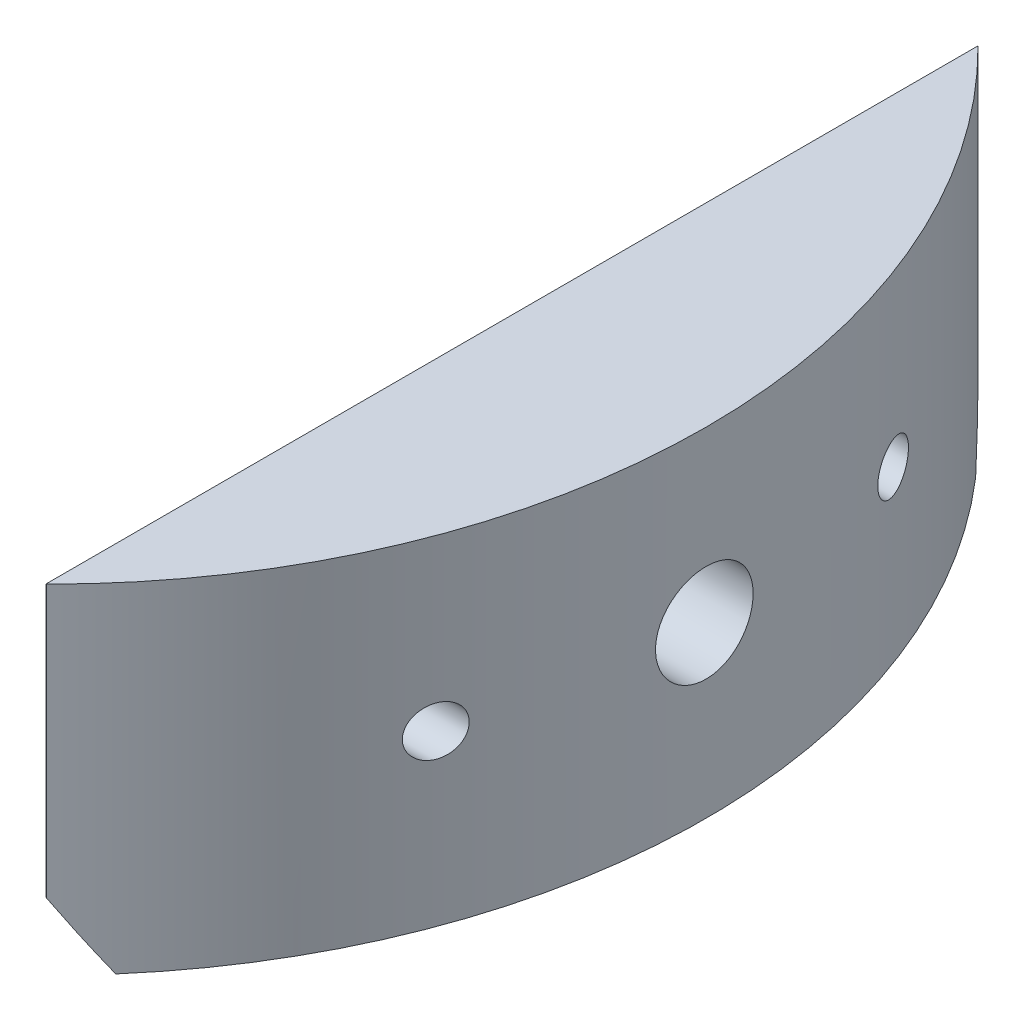
ISO-10303-21;
HEADER;
FILE_DESCRIPTION(('STEP AP214'),'2;1');
FILE_NAME('part.step','',(''),(''),'','','');
FILE_SCHEMA(('AUTOMOTIVE_DESIGN { 1 0 10303 214 1 1 1 1 }'));
ENDSEC;
DATA;
#1=APPLICATION_CONTEXT('core data for automotive mechanical design processes');
#2=APPLICATION_PROTOCOL_DEFINITION('international standard','automotive_design',2000,#1);
#3=PRODUCT_CONTEXT('',#1,'mechanical');
#4=PRODUCT('Part','Part','',(#3));
#5=PRODUCT_RELATED_PRODUCT_CATEGORY('part','',(#4));
#6=PRODUCT_DEFINITION_FORMATION('','',#4);
#7=PRODUCT_DEFINITION_CONTEXT('part definition',#1,'design');
#8=PRODUCT_DEFINITION('design','',#6,#7);
#9=PRODUCT_DEFINITION_SHAPE('','',#8);
#10=(LENGTH_UNIT() NAMED_UNIT(*) SI_UNIT(.MILLI.,.METRE.));
#11=(NAMED_UNIT(*) PLANE_ANGLE_UNIT() SI_UNIT($,.RADIAN.));
#12=(NAMED_UNIT(*) SI_UNIT($,.STERADIAN.) SOLID_ANGLE_UNIT());
#13=UNCERTAINTY_MEASURE_WITH_UNIT(LENGTH_MEASURE(1.E-05),#10,'distance_accuracy_value','');
#14=(GEOMETRIC_REPRESENTATION_CONTEXT(3) GLOBAL_UNCERTAINTY_ASSIGNED_CONTEXT((#13)) GLOBAL_UNIT_ASSIGNED_CONTEXT((#10,
#11,#12)) REPRESENTATION_CONTEXT('',''));
#15=CARTESIAN_POINT('',(0.,0.,0.));
#16=DIRECTION('',(0.,0.,1.));
#17=DIRECTION('',(1.,0.,0.));
#18=AXIS2_PLACEMENT_3D('',#15,#16,#17);
#19=CARTESIAN_POINT('',(0.,25.4,0.));
#20=DIRECTION('',(0.,-1.,0.));
#21=DIRECTION('',(0.,0.,-1.));
#22=AXIS2_PLACEMENT_3D('',#19,#20,#21);
#23=CYLINDRICAL_SURFACE('',#22,49.2125);
#24=CARTESIAN_POINT('',(46.7684099987374,12.7,-15.3162));
#25=CARTESIAN_POINT('',(46.7684086521971,12.6011724642372,-15.3162050057137));
#26=CARTESIAN_POINT('',(46.7657777660005,12.5022678312592,-15.3242448379959));
#27=CARTESIAN_POINT('',(46.7553157915948,12.3072429696195,-15.3561346399123));
#28=CARTESIAN_POINT('',(46.7474780959535,12.2111264410113,-15.3800046980093));
#29=CARTESIAN_POINT('',(46.7268223733524,12.0246036406234,-15.4426456876634));
#30=CARTESIAN_POINT('',(46.7140115203326,11.9341893605753,-15.4813951543245));
#31=CARTESIAN_POINT('',(46.6837441181245,11.7613487520306,-15.5724269406278));
#32=CARTESIAN_POINT('',(46.6662884399473,11.6789209298395,-15.6247067229756));
#33=CARTESIAN_POINT('',(46.6267802985042,11.5225179957934,-15.7422177568712));
#34=CARTESIAN_POINT('',(46.6046449600715,11.4487386838091,-15.8076813354027));
#35=CARTESIAN_POINT('',(46.5565335610681,11.3131886439074,-15.9488210154225));
#36=CARTESIAN_POINT('',(46.5305566652984,11.251420534141,-16.0244993374007));
#37=CARTESIAN_POINT('',(46.4740556356259,11.1384954267648,-16.1876525675942));
#38=CARTESIAN_POINT('',(46.4433744444337,11.0879792431591,-16.2755163413851));
#39=CARTESIAN_POINT('',(46.3792003762797,11.0023631522159,-16.4574980119421));
#40=CARTESIAN_POINT('',(46.3457067763539,10.9672672233832,-16.5516175155159));
#41=CARTESIAN_POINT('',(46.2748162469907,10.9115341872667,-16.7488234541507));
#42=CARTESIAN_POINT('',(46.2373061776796,10.8917819658347,-16.852119534));
#43=CARTESIAN_POINT('',(46.1609752261513,10.8701807805557,-17.0600938798005));
#44=CARTESIAN_POINT('',(46.1221540203343,10.8683362693725,-17.1647724830308));
#45=CARTESIAN_POINT('',(46.0425704848591,10.882747054891,-17.3771470130252));
#46=CARTESIAN_POINT('',(46.0017945998122,10.8997586788135,-17.4847872507144));
#47=CARTESIAN_POINT('',(45.9210870524939,10.9526891160619,-17.6956683139762));
#48=CARTESIAN_POINT('',(45.8811555156494,10.9886107182048,-17.7989084882052));
#49=CARTESIAN_POINT('',(45.8031371215393,11.0789642470719,-17.9987326248014));
#50=CARTESIAN_POINT('',(45.7650654047635,11.1335260125096,-18.0952640216327));
#51=CARTESIAN_POINT('',(45.6924819190473,11.2599804031564,-18.2777708051632));
#52=CARTESIAN_POINT('',(45.6579695847801,11.3318702701194,-18.3637478685921));
#53=CARTESIAN_POINT('',(45.5952828513195,11.4880913974879,-18.5188300658715));
#54=CARTESIAN_POINT('',(45.5669091983341,11.5718050976922,-18.5884751857033));
#55=CARTESIAN_POINT('',(45.5161521956982,11.75152292809,-18.7124169228493));
#56=CARTESIAN_POINT('',(45.4937656939147,11.8475205514904,-18.7667216174865));
#57=CARTESIAN_POINT('',(45.4575857373936,12.0414561193848,-18.8541809366939));
#58=CARTESIAN_POINT('',(45.4432800035134,12.1387279040556,-18.8886007660535));
#59=CARTESIAN_POINT('',(45.4216086360032,12.3383950109453,-18.9406556049076));
#60=CARTESIAN_POINT('',(45.414239681114,12.4407878564957,-18.9582986469983));
#61=CARTESIAN_POINT('',(45.4070966509364,12.6405541294195,-18.9753999988982));
#62=CARTESIAN_POINT('',(45.4068567594513,12.7378170805185,-18.9759736347808));
#63=CARTESIAN_POINT('',(45.412804751763,12.9309992323482,-18.9617346253601));
#64=CARTESIAN_POINT('',(45.4189916911404,13.0269186284147,-18.9469242407301));
#65=CARTESIAN_POINT('',(45.4373119842403,13.2129394614467,-18.9029464064817));
#66=CARTESIAN_POINT('',(45.4493356805496,13.3031147794746,-18.8740436727597));
#67=CARTESIAN_POINT('',(45.4787295220355,13.4771956954418,-18.8031056823425));
#68=CARTESIAN_POINT('',(45.4961003258762,13.5611005193896,-18.7610688077561));
#69=CARTESIAN_POINT('',(45.536189220959,13.7236136462891,-18.6635606173586));
#70=CARTESIAN_POINT('',(45.5590779917697,13.8019206210489,-18.6076583889299));
#71=CARTESIAN_POINT('',(45.6089443864387,13.9481035752348,-18.4850945507875));
#72=CARTESIAN_POINT('',(45.6359231702689,14.0159765844416,-18.4184298883816));
#73=CARTESIAN_POINT('',(45.6950284066856,14.1443255062568,-18.2713225619695));
#74=CARTESIAN_POINT('',(45.7273811979664,14.2039726044495,-18.1902479045402));
#75=CARTESIAN_POINT('',(45.7946471581998,14.3088700880425,-18.0202333208621));
#76=CARTESIAN_POINT('',(45.8295611604559,14.3541157620714,-17.9312908328179));
#77=CARTESIAN_POINT('',(45.9033690575196,14.4320159424258,-17.7415304899227));
#78=CARTESIAN_POINT('',(45.9423721054078,14.463604126166,-17.6403163910872));
#79=CARTESIAN_POINT('',(46.0209920351074,14.5088745002086,-17.434179770114));
#80=CARTESIAN_POINT('',(46.0606090676733,14.5225522200635,-17.3292563288342));
#81=CARTESIAN_POINT('',(46.1408391229792,14.5318158742304,-17.1145180433361));
#82=CARTESIAN_POINT('',(46.1814346586814,14.5267126726242,-17.0046660103387));
#83=CARTESIAN_POINT('',(46.2609817524735,14.4967875421471,-16.787052991022));
#84=CARTESIAN_POINT('',(46.2999332625077,14.4719650372923,-16.6792920658762));
#85=CARTESIAN_POINT('',(46.3748048807062,14.4031974266344,-16.4699694005561));
#86=CARTESIAN_POINT('',(46.4107465430992,14.3594052384463,-16.3683653431054));
#87=CARTESIAN_POINT('',(46.4789148005808,14.2535456660523,-16.173783333032));
#88=CARTESIAN_POINT('',(46.5111423993901,14.1914832355466,-16.0808030511776));
#89=CARTESIAN_POINT('',(46.5696024820653,14.0536747296366,-15.9106891299849));
#90=CARTESIAN_POINT('',(46.5960372776576,13.9786564806708,-15.8330360191128));
#91=CARTESIAN_POINT('',(46.6438848767419,13.8151583422248,-15.6915185636615));
#92=CARTESIAN_POINT('',(46.6652980772312,13.7266795178232,-15.6276531290878));
#93=CARTESIAN_POINT('',(46.7014026658666,13.5441626366254,-15.5194145748288));
#94=CARTESIAN_POINT('',(46.7164032359491,13.4507130525214,-15.4741504179755));
#95=CARTESIAN_POINT('',(46.7409002308169,13.2569555979401,-15.3999982151965));
#96=CARTESIAN_POINT('',(46.7504057763676,13.1566594028762,-15.3710830346315));
#97=CARTESIAN_POINT('',(46.7608151620969,12.9962675013319,-15.3393759219307));
#98=CARTESIAN_POINT('',(46.7636598295931,12.9373953394906,-15.3306983832038));
#99=CARTESIAN_POINT('',(46.7674576336007,12.8190247665182,-15.3191089751803));
#100=CARTESIAN_POINT('',(46.7684108097933,12.7595263685512,-15.3161969849298));
#101=CARTESIAN_POINT('',(46.7684099987374,12.7,-15.3162));
#102=B_SPLINE_CURVE_WITH_KNOTS('',3,(#24,#25,#26,#27,#28,#29,#30,#31,#32,#33,#34,#35,#36,#37,
#38,#39,#40,#41,#42,#43,#44,#45,#46,#47,#48,#49,#50,#51,#52,#53,#54,#55,#56,#57,#58,#59,#60,#61,
#62,#63,#64,#65,#66,#67,#68,#69,#70,#71,#72,#73,#74,#75,#76,#77,#78,#79,#80,#81,#82,#83,#84,#85,
#86,#87,#88,#89,#90,#91,#92,#93,#94,#95,#96,#97,#98,#99,#100,#101),.UNSPECIFIED.,.T.,.F.,(4,2,2,
2,2,2,2,2,2,2,2,2,2,2,2,2,2,2,2,2,2,2,2,2,2,2,2,2,2,2,2,2,2,2,2,2,2,2,4),(0.,0.296259338814519,
0.592895350200701,0.889105035206473,1.18525921321211,1.4871789743927,1.7891644731773,
2.10544701036159,2.42181110221167,2.7552895294915,3.0888508724121,3.43629171455644,
3.78378381114951,4.13374746882215,4.48365545685124,4.819473351923,5.15511409498784,
5.46598207550416,5.77670113977477,6.06706968754339,6.35739557184754,6.64246653834438,
6.9275726343402,7.2229905902932,7.51849248726369,7.83430056492126,8.15021185206085,
8.48762039415797,8.8251131373077,9.17511104336672,9.52511917293849,9.87235685961569,
10.2195004846174,10.551268468968,10.8830102155547,11.1961811572681,11.5088307871589,
11.6872791561261,11.865723781431),.UNSPECIFIED.);
#103=CARTESIAN_POINT('',(46.7684099987374,12.7,-15.3162));
#104=VERTEX_POINT('',#103);
#105=EDGE_CURVE('E192',#104,#104,#102,.T.);
#106=ORIENTED_EDGE('',*,*,#105,.F.);
#107=EDGE_LOOP('',(#106));
#108=FACE_BOUND('',#107,.T.);
#109=CARTESIAN_POINT('',(49.0763906424464,12.7,-3.65760000000001));
#110=CARTESIAN_POINT('',(49.0763924539215,12.4948556429095,-3.65759100680606));
#111=CARTESIAN_POINT('',(49.0776907688414,12.2895697629848,-3.64028302389104));
#112=CARTESIAN_POINT('',(49.0827440075584,11.8846725951792,-3.57148994820883));
#113=CARTESIAN_POINT('',(49.0865017502924,11.6850680934317,-3.51996563651635));
#114=CARTESIAN_POINT('',(49.0960458811427,11.2974568927662,-3.38423349369214));
#115=CARTESIAN_POINT('',(49.1018311560673,11.1094438961479,-3.30004359449011));
#116=CARTESIAN_POINT('',(49.1147770924699,10.7502648928534,-3.10140070972413));
#117=CARTESIAN_POINT('',(49.1219374500576,10.5790951764659,-2.98695440865909));
#118=CARTESIAN_POINT('',(49.1368434373881,10.2580605589493,-2.7307901982098));
#119=CARTESIAN_POINT('',(49.1445901151316,10.1082352554268,-2.5890227202828));
#120=CARTESIAN_POINT('',(49.1597862245454,9.83448212967928,-2.28234438776111));
#121=CARTESIAN_POINT('',(49.1672356434958,9.71055541470813,-2.11743254416868));
#122=CARTESIAN_POINT('',(49.1810074749461,9.49198941053713,-1.76891541365389));
#123=CARTESIAN_POINT('',(49.1873285878735,9.3973838019796,-1.58528894881));
#124=CARTESIAN_POINT('',(49.1981203829006,9.24036101122304,-1.20470313517021));
#125=CARTESIAN_POINT('',(49.2025910914979,9.17794336809254,-1.00774397734409));
#126=CARTESIAN_POINT('',(49.2091710536409,9.08718070589616,-0.606473079902294));
#127=CARTESIAN_POINT('',(49.2112846932167,9.05877239504998,-0.402175729182613));
#128=CARTESIAN_POINT('',(49.2129271916103,9.03663923948106,0.0082977644657049));
#129=CARTESIAN_POINT('',(49.2124560896536,9.04291386841689,0.214473878835189));
#130=CARTESIAN_POINT('',(49.2089858225819,9.08991651915138,0.622423381537659));
#131=CARTESIAN_POINT('',(49.2059916520959,9.13057647284314,0.82420466084955));
#132=CARTESIAN_POINT('',(49.1978179167889,9.24508984317437,1.21807037843478));
#133=CARTESIAN_POINT('',(49.1926383348162,9.31894352032983,1.41015474059014));
#134=CARTESIAN_POINT('',(49.1806681029075,9.49782433574217,1.77939156273732));
#135=CARTESIAN_POINT('',(49.1738758700651,9.60288212816587,1.95652911859023));
#136=CARTESIAN_POINT('',(49.1594441611752,9.84116669799135,2.29068133709093));
#137=CARTESIAN_POINT('',(49.151804671517,9.97439392794915,2.44769567638412));
#138=CARTESIAN_POINT('',(49.1365157687859,10.2656195514269,2.73754206058993));
#139=CARTESIAN_POINT('',(49.1288663763819,10.4236770605825,2.87031471686105));
#140=CARTESIAN_POINT('',(49.1144384794388,10.7598700471122,3.10745042129638));
#141=CARTESIAN_POINT('',(49.107659975423,10.9380055365501,3.21181345239057));
#142=CARTESIAN_POINT('',(49.095739754184,11.3093377289108,3.38916424446119));
#143=CARTESIAN_POINT('',(49.0905981835845,11.5025357790907,3.46214919504163));
#144=CARTESIAN_POINT('',(49.0825364869125,11.8984902322246,3.57462947368282));
#145=CARTESIAN_POINT('',(49.0796163237909,12.1012464757056,3.61412536028079));
#146=CARTESIAN_POINT('',(49.0763337664416,12.5100429041151,3.65843174416733));
#147=CARTESIAN_POINT('',(49.0759652742063,12.7160740795506,3.66332493590338));
#148=CARTESIAN_POINT('',(49.0778116689254,13.1260279110675,3.63850338787269));
#149=CARTESIAN_POINT('',(49.0800265367773,13.3299505827291,3.60878890401276));
#150=CARTESIAN_POINT('',(49.086784511573,13.7296630581417,3.51566431394815));
#151=CARTESIAN_POINT('',(49.091324968141,13.92546184634,3.45229256248853));
#152=CARTESIAN_POINT('',(49.1022202751595,14.303646393905,3.29369125049327));
#153=CARTESIAN_POINT('',(49.1085751488392,14.4860319815113,3.19846128208946));
#154=CARTESIAN_POINT('',(49.1223980078272,14.8325919640664,2.97863654487489));
#155=CARTESIAN_POINT('',(49.1298680775526,14.9967312304581,2.85398652790749));
#156=CARTESIAN_POINT('',(49.145072436177,15.3017847679267,2.57894012847181));
#157=CARTESIAN_POINT('',(49.152806728702,15.4426987201143,2.4285433925525));
#158=CARTESIAN_POINT('',(49.1676860596433,15.6975824958195,2.10591608584849));
#159=CARTESIAN_POINT('',(49.1748299071961,15.8114986917781,1.93364308550239));
#160=CARTESIAN_POINT('',(49.1877062894064,16.0087858075999,1.57236575462658));
#161=CARTESIAN_POINT('',(49.1934388356664,16.0921569785804,1.38336156166354));
#162=CARTESIAN_POINT('',(49.2028411460009,16.2258947856325,0.994181471114065));
#163=CARTESIAN_POINT('',(49.2065130048435,16.2762949466742,0.794017146681091));
#164=CARTESIAN_POINT('',(49.2113886608955,16.3427696966642,0.388038992148285));
#165=CARTESIAN_POINT('',(49.2125924943215,16.3588447893079,0.182225244994506));
#166=CARTESIAN_POINT('',(49.2123965440287,16.3562077223765,-0.22867987394079));
#167=CARTESIAN_POINT('',(49.2110030274044,16.3375792982832,-0.433771791325607));
#168=CARTESIAN_POINT('',(49.2057814136629,16.2662381451048,-0.837906344973107));
#169=CARTESIAN_POINT('',(49.2019533127312,16.2135253626179,-1.03694897175756));
#170=CARTESIAN_POINT('',(49.1922923846927,16.0755320770462,-1.42334341594362));
#171=CARTESIAN_POINT('',(49.1864596195539,15.9902525806537,-1.61069559450857));
#172=CARTESIAN_POINT('',(49.1734429989014,15.7895569096568,-1.96843585143514));
#173=CARTESIAN_POINT('',(49.1662591711148,15.6741413534996,-2.13882427782492));
#174=CARTESIAN_POINT('',(49.1513269369548,15.4161366741602,-2.45822773793971));
#175=CARTESIAN_POINT('',(49.1435772775094,15.273486036024,-2.60719302224091));
#176=CARTESIAN_POINT('',(49.128397321283,14.9651622829508,-2.87912026490262));
#177=CARTESIAN_POINT('',(49.1209671026717,14.7994835743645,-3.0020758870126));
#178=CARTESIAN_POINT('',(49.10725448086,14.4495476686795,-3.21862420939656));
#179=CARTESIAN_POINT('',(49.1009739025441,14.2652616423563,-3.31217039250988));
#180=CARTESIAN_POINT('',(49.090294358755,13.8836815636051,-3.46687544399207));
#181=CARTESIAN_POINT('',(49.085893212172,13.6864028980473,-3.52807187448912));
#182=CARTESIAN_POINT('',(49.0806128491451,13.3566165062733,-3.60060440962733));
#183=CARTESIAN_POINT('',(49.0790367045938,13.226235031559,-3.62194970808312));
#184=CARTESIAN_POINT('',(49.0769250195616,12.963921897643,-3.65045038179332));
#185=CARTESIAN_POINT('',(49.0763894769401,12.8319902416304,-3.65760578623688));
#186=CARTESIAN_POINT('',(49.0763906424464,12.7,-3.65760000000001));
#187=B_SPLINE_CURVE_WITH_KNOTS('',3,(#109,#110,#111,#112,#113,#114,#115,#116,#117,#118,#119,
#120,#121,#122,#123,#124,#125,#126,#127,#128,#129,#130,#131,#132,#133,#134,#135,#136,#137,#138,
#139,#140,#141,#142,#143,#144,#145,#146,#147,#148,#149,#150,#151,#152,#153,#154,#155,#156,#157,
#158,#159,#160,#161,#162,#163,#164,#165,#166,#167,#168,#169,#170,#171,#172,#173,#174,#175,#176,
#177,#178,#179,#180,#181,#182,#183,#184,#185,#186),.UNSPECIFIED.,.T.,.F.,(4,2,2,2,2,2,2,2,2,2,2,
2,2,2,2,2,2,2,2,2,2,2,2,2,2,2,2,2,2,2,2,2,2,2,2,2,2,2,4),(0.,0.614951185792434,1.23060845107773,
1.84592822545913,2.4611121716561,3.07742293011323,3.69376003259076,4.31080250900396,
4.9278361491271,5.54371968816141,6.1595938806944,6.77425175418898,7.38891445181857,
8.00418298765852,8.61946140884458,9.23622751982483,9.85299400139023,10.469815712501,
11.086627135935,11.7019639872088,12.3172962883969,12.9319288764142,13.5465693336313,
14.1623733442518,14.7781858093099,15.3952114417801,16.0122320014334,16.6286241945064,
17.2450073424108,17.8599051566334,18.4748039342492,19.0896837058397,19.7045508599624,
20.3208235846617,20.9372462679736,21.5546391032479,22.1713134844285,22.5669749772433,
22.9626356561663),.UNSPECIFIED.);
#188=CARTESIAN_POINT('',(49.0763906424464,12.7,-3.65760000000001));
#189=VERTEX_POINT('',#188);
#190=EDGE_CURVE('E138',#189,#189,#187,.T.);
#191=ORIENTED_EDGE('',*,*,#190,.T.);
#192=EDGE_LOOP('',(#191));
#193=FACE_BOUND('',#192,.T.);
#194=DIRECTION('',(0.,-1.,0.));
#195=VECTOR('',#194,1.);
#196=CARTESIAN_POINT('',(34.6715233476985,25.4,34.925));
#197=LINE('',#196,#195);
#198=CARTESIAN_POINT('',(34.6715233476985,25.4,34.925));
#199=VERTEX_POINT('',#198);
#200=CARTESIAN_POINT('',(34.6715233476985,5.02920000000004,34.925));
#201=VERTEX_POINT('',#200);
#202=EDGE_CURVE('E143',#199,#201,#197,.T.);
#203=ORIENTED_EDGE('',*,*,#202,.T.);
#204=CARTESIAN_POINT('',(0.,74.3722466953974,0.));
#205=DIRECTION('',(0.894427190999917,0.447213595499956,0.));
#206=DIRECTION('',(0.447213595499956,-0.894427190999917,0.));
#207=AXIS2_PLACEMENT_3D('',#204,#205,#206);
#208=ELLIPSE('',#207,110.042495342709,49.2125);
#209=CARTESIAN_POINT('',(37.1861233476985,0.,32.2344906368901));
#210=VERTEX_POINT('',#209);
#211=EDGE_CURVE('E244',#201,#210,#208,.T.);
#212=ORIENTED_EDGE('',*,*,#211,.T.);
#213=CARTESIAN_POINT('',(0.,0.,0.));
#214=DIRECTION('',(0.,1.,0.));
#215=DIRECTION('',(0.,0.,1.));
#216=AXIS2_PLACEMENT_3D('',#213,#214,#215);
#217=CIRCLE('',#216,49.2125);
#218=CARTESIAN_POINT('',(37.1861233476985,0.,-32.2344906368901));
#219=VERTEX_POINT('',#218);
#220=EDGE_CURVE('E134',#210,#219,#217,.T.);
#221=ORIENTED_EDGE('',*,*,#220,.T.);
#222=CARTESIAN_POINT('',(0.,74.3722466953974,0.));
#223=DIRECTION('',(0.894427190999917,0.447213595499956,0.));
#224=DIRECTION('',(0.447213595499956,-0.894427190999917,0.));
#225=AXIS2_PLACEMENT_3D('',#222,#223,#224);
#226=ELLIPSE('',#225,110.042495342709,49.2125);
#227=CARTESIAN_POINT('',(34.6715233476985,5.02920000000004,-34.925));
#228=VERTEX_POINT('',#227);
#229=EDGE_CURVE('E81',#219,#228,#226,.T.);
#230=ORIENTED_EDGE('',*,*,#229,.T.);
#231=DIRECTION('',(0.,-1.,0.));
#232=VECTOR('',#231,1.);
#233=CARTESIAN_POINT('',(34.6715233476985,25.4,-34.925));
#234=LINE('',#233,#232);
#235=CARTESIAN_POINT('',(34.6715233476985,25.4,-34.925));
#236=VERTEX_POINT('',#235);
#237=EDGE_CURVE('E236',#236,#228,#234,.T.);
#238=ORIENTED_EDGE('',*,*,#237,.F.);
#239=CARTESIAN_POINT('',(0.,25.4,0.));
#240=DIRECTION('',(0.,1.,0.));
#241=DIRECTION('',(0.,0.,1.));
#242=AXIS2_PLACEMENT_3D('',#239,#240,#241);
#243=CIRCLE('',#242,49.2125);
#244=EDGE_CURVE('E132',#199,#236,#243,.T.);
#245=ORIENTED_EDGE('',*,*,#244,.F.);
#246=EDGE_LOOP('',(#203,#212,#221,#230,#238,#245));
#247=FACE_BOUND('',#246,.T.);
#248=CARTESIAN_POINT('',(45.4077644220677,12.7,18.9738));
#249=CARTESIAN_POINT('',(45.4077669262152,12.7970446404455,18.9737947179405));
#250=CARTESIAN_POINT('',(45.4110099088364,12.8941670842188,18.9660387343693));
#251=CARTESIAN_POINT('',(45.4238288201605,13.0856208736305,18.9353160995243));
#252=CARTESIAN_POINT('',(45.4334130119078,13.1799484095235,18.912329601756));
#253=CARTESIAN_POINT('',(45.4584191214234,13.362885821621,18.852144133339));
#254=CARTESIAN_POINT('',(45.4738280468525,13.4515079129465,18.8149767920104));
#255=CARTESIAN_POINT('',(45.5097909533621,13.6210175609357,18.727821433832));
#256=CARTESIAN_POINT('',(45.5303444016407,13.7019059173595,18.6778347446281));
#257=CARTESIAN_POINT('',(45.5765566426959,13.8568081060672,18.5647915124594));
#258=CARTESIAN_POINT('',(45.6023655248908,13.9304938040263,18.5013476813668));
#259=CARTESIAN_POINT('',(45.6576613165247,14.0662788285649,18.3644647456801));
#260=CARTESIAN_POINT('',(45.6871493525864,14.1283745914989,18.2910225787861));
#261=CARTESIAN_POINT('',(45.7511022643653,14.2439521698834,18.1304930488277));
#262=CARTESIAN_POINT('',(45.7857729968842,14.2964822669557,18.0428023007857));
#263=CARTESIAN_POINT('',(45.8571552909513,14.3860426369286,17.8606003211613));
#264=CARTESIAN_POINT('',(45.8938675180836,14.423067820836,17.7660868621559));
#265=CARTESIAN_POINT('',(45.9705955445098,14.4827575250136,17.566632958564));
#266=CARTESIAN_POINT('',(46.0106754576843,14.5043957039984,17.4614089281674));
#267=CARTESIAN_POINT('',(46.0908097954272,14.5289885531311,17.2487774610334));
#268=CARTESIAN_POINT('',(46.1308642136189,14.5319396327873,17.1413696086788));
#269=CARTESIAN_POINT('',(46.2108229623938,14.5187966732795,16.9246463287715));
#270=CARTESIAN_POINT('',(46.2506997230773,14.5022356207556,16.8153483993263));
#271=CARTESIAN_POINT('',(46.328159578554,14.449429989262,16.6007470549437));
#272=CARTESIAN_POINT('',(46.3657427841644,14.4131863621299,16.4954434471068));
#273=CARTESIAN_POINT('',(46.4368160956373,14.3225595592882,16.2942758967126));
#274=CARTESIAN_POINT('',(46.4703737993362,14.2685595182457,16.1982637324166));
#275=CARTESIAN_POINT('',(46.5332994004954,14.1433906943783,16.0165992401506));
#276=CARTESIAN_POINT('',(46.5626685051461,14.0722268742794,15.9309439283342));
#277=CARTESIAN_POINT('',(46.6149781663402,13.918549398485,15.7772064624074));
#278=CARTESIAN_POINT('',(46.6381685002004,13.8367905781343,15.7084552181711));
#279=CARTESIAN_POINT('',(46.6793075231841,13.6616479211154,15.585782168903));
#280=CARTESIAN_POINT('',(46.6972580682869,13.5682682174237,15.5318551134083));
#281=CARTESIAN_POINT('',(46.726543935076,13.3781253278627,15.4435197820858));
#282=CARTESIAN_POINT('',(46.7381898806466,13.2818339136592,15.4081979203201));
#283=CARTESIAN_POINT('',(46.7559933642415,13.0842309821873,15.3540894523521));
#284=CARTESIAN_POINT('',(46.7621523181768,12.982920767141,15.3352985803656));
#285=CARTESIAN_POINT('',(46.7686791235709,12.7823243967867,15.3153815932179));
#286=CARTESIAN_POINT('',(46.7692593597524,12.6831089217014,15.313607641097));
#287=CARTESIAN_POINT('',(46.7651673593571,12.4858097652316,15.3260993313129));
#288=CARTESIAN_POINT('',(46.7604956487661,12.3877259715023,15.3403633674351));
#289=CARTESIAN_POINT('',(46.7461017548906,12.1965064364538,15.3841686423257));
#290=CARTESIAN_POINT('',(46.7364323784836,12.1033299704819,15.413550131062));
#291=CARTESIAN_POINT('',(46.7123244894025,11.9233569699307,15.4864573909856));
#292=CARTESIAN_POINT('',(46.6978857336566,11.8365607607974,15.5299838830724));
#293=CARTESIAN_POINT('',(46.664287941254,11.6699996324518,15.6306507740823));
#294=CARTESIAN_POINT('',(46.6450459373923,11.5903959286576,15.68802980697));
#295=CARTESIAN_POINT('',(46.6024621837766,11.441968118069,15.8140789192295));
#296=CARTESIAN_POINT('',(46.579119741716,11.3731458352978,15.8827509051469));
#297=CARTESIAN_POINT('',(46.5278267872817,11.2450980654768,16.0324044675893));
#298=CARTESIAN_POINT('',(46.4997240458057,11.186396269747,16.1137815789483));
#299=CARTESIAN_POINT('',(46.440339932799,11.083417487093,16.2841370680043));
#300=CARTESIAN_POINT('',(46.4090577975285,11.0391439768618,16.3731172712603));
#301=CARTESIAN_POINT('',(46.3422849641091,10.9637716538783,16.5611971530815));
#302=CARTESIAN_POINT('',(46.3066584345403,10.9335088308773,16.6605836822467));
#303=CARTESIAN_POINT('',(46.2335556638749,10.8902221575582,16.8623845578082));
#304=CARTESIAN_POINT('',(46.1960789366909,10.8772028627611,16.964799697022));
#305=CARTESIAN_POINT('',(46.1183721856851,10.8682810671002,17.1749537492594));
#306=CARTESIAN_POINT('',(46.0780963131919,10.8732293666318,17.2827124356476));
#307=CARTESIAN_POINT('',(45.9976309566718,10.9019330506889,17.4957445848948));
#308=CARTESIAN_POINT('',(45.9574414909064,10.925692081088,17.6010175619028));
#309=CARTESIAN_POINT('',(45.8775306368869,10.9921806956535,17.8082824056543));
#310=CARTESIAN_POINT('',(45.8378351491591,11.0352841901514,17.9101648710943));
#311=CARTESIAN_POINT('',(45.7611183549443,11.1396771628102,18.1052810091642));
#312=CARTESIAN_POINT('',(45.7240968543224,11.2009653190878,18.1985153098019));
#313=CARTESIAN_POINT('',(45.655064055533,11.3386417893509,18.3710017952298));
#314=CARTESIAN_POINT('',(45.6229496656445,11.414608661304,18.4505481398514));
#315=CARTESIAN_POINT('',(45.5640458013872,11.5808065274528,18.5955377895739));
#316=CARTESIAN_POINT('',(45.5372554983225,11.6710352978477,18.6609832896098));
#317=CARTESIAN_POINT('',(45.4919404880856,11.8568102865007,18.7711702356082));
#318=CARTESIAN_POINT('',(45.4729860139908,11.9516090991102,18.8169954569552));
#319=CARTESIAN_POINT('',(45.4419407037823,12.1485597907471,18.8918460138188));
#320=CARTESIAN_POINT('',(45.4298362715584,12.2506966474875,18.9209046303145));
#321=CARTESIAN_POINT('',(45.4169391263653,12.4115132874756,18.951831587237));
#322=CARTESIAN_POINT('',(45.4135055981547,12.4688371051807,18.9600553992909));
#323=CARTESIAN_POINT('',(45.4089175311032,12.5840980411926,18.9710411041635));
#324=CARTESIAN_POINT('',(45.407762926338,12.6420351417099,18.9738031549793));
#325=CARTESIAN_POINT('',(45.4077644220677,12.7,18.9738));
#326=B_SPLINE_CURVE_WITH_KNOTS('',3,(#248,#249,#250,#251,#252,#253,#254,#255,#256,#257,#258,
#259,#260,#261,#262,#263,#264,#265,#266,#267,#268,#269,#270,#271,#272,#273,#274,#275,#276,#277,
#278,#279,#280,#281,#282,#283,#284,#285,#286,#287,#288,#289,#290,#291,#292,#293,#294,#295,#296,
#297,#298,#299,#300,#301,#302,#303,#304,#305,#306,#307,#308,#309,#310,#311,#312,#313,#314,#315,
#316,#317,#318,#319,#320,#321,#322,#323,#324,#325),.UNSPECIFIED.,.T.,.F.,(4,2,2,2,2,2,2,2,2,2,2,
2,2,2,2,2,2,2,2,2,2,2,2,2,2,2,2,2,2,2,2,2,2,2,2,2,2,2,4),(0.,0.290911742229182,0.58220331161223,
0.872848939300426,1.16346447819278,1.46398192016058,1.76459161283987,2.0870094348739,
2.40953299748727,2.75194497603559,3.09442274275533,3.44526688132525,3.79609405479615,
4.13980004140206,4.48340676792962,4.80965796070186,5.13579345180739,5.44391502994817,
5.75195707467427,6.04822311271886,6.34445948217444,6.63762784611677,6.93081115371628,
7.22945925155752,7.52815782086508,7.83938664191161,8.15069040244578,8.47872571290518,
8.80684766885051,9.15070514741421,9.4946292883445,9.8455083311664,10.1963618740602,
10.5383353892096,10.8802556343002,11.1995413844878,11.5181911665725,11.691958060428,
11.8657199275011),.UNSPECIFIED.);
#327=CARTESIAN_POINT('',(45.4077644220677,12.7,18.9738));
#328=VERTEX_POINT('',#327);
#329=EDGE_CURVE('E199',#328,#328,#326,.T.);
#330=ORIENTED_EDGE('',*,*,#329,.T.);
#331=EDGE_LOOP('',(#330));
#332=FACE_BOUND('',#331,.T.);
#333=ADVANCED_FACE('F65',(#108,#193,#247,#332),#23,.T.);
#334=CARTESIAN_POINT('',(34.6461233476985,25.4,0.));
#335=DIRECTION('',(1.,0.,0.));
#336=DIRECTION('',(0.,0.,-1.));
#337=AXIS2_PLACEMENT_3D('',#334,#335,#336);
#338=PLANE('',#337);
#339=CARTESIAN_POINT('',(34.6461233476985,12.7,-17.145));
#340=DIRECTION('',(1.,0.,0.));
#341=DIRECTION('',(0.,0.,-1.));
#342=AXIS2_PLACEMENT_3D('',#339,#340,#341);
#343=CIRCLE('',#342,1.8288);
#344=CARTESIAN_POINT('',(34.6461233476985,12.7,-18.9738));
#345=VERTEX_POINT('',#344);
#346=EDGE_CURVE('E157',#345,#345,#343,.T.);
#347=ORIENTED_EDGE('',*,*,#346,.T.);
#348=EDGE_LOOP('',(#347));
#349=FACE_BOUND('',#348,.T.);
#350=CARTESIAN_POINT('',(34.6461233476985,12.7,0.));
#351=DIRECTION('',(-1.,0.,0.));
#352=DIRECTION('',(0.,0.,1.));
#353=AXIS2_PLACEMENT_3D('',#350,#351,#352);
#354=CIRCLE('',#353,1.27);
#355=CARTESIAN_POINT('',(34.6461233476985,12.7,1.27));
#356=VERTEX_POINT('',#355);
#357=EDGE_CURVE('E149',#356,#356,#354,.T.);
#358=ORIENTED_EDGE('',*,*,#357,.F.);
#359=EDGE_LOOP('',(#358));
#360=FACE_BOUND('',#359,.T.);
#361=DIRECTION('',(0.,-1.,0.));
#362=VECTOR('',#361,1.);
#363=CARTESIAN_POINT('',(34.6461233476985,25.4,-34.925));
#364=LINE('',#363,#362);
#365=CARTESIAN_POINT('',(34.6461233476985,25.4,-34.925));
#366=VERTEX_POINT('',#365);
#367=CARTESIAN_POINT('',(34.6461233476985,5.08000000000004,-34.925));
#368=VERTEX_POINT('',#367);
#369=EDGE_CURVE('E118',#366,#368,#364,.T.);
#370=ORIENTED_EDGE('',*,*,#369,.T.);
#371=DIRECTION('',(0.,0.,1.));
#372=VECTOR('',#371,1.);
#373=CARTESIAN_POINT('',(34.6461233476985,5.08000000000004,0.));
#374=LINE('',#373,#372);
#375=CARTESIAN_POINT('',(34.6461233476985,5.08000000000004,34.925));
#376=VERTEX_POINT('',#375);
#377=EDGE_CURVE('E141',#368,#376,#374,.T.);
#378=ORIENTED_EDGE('',*,*,#377,.T.);
#379=DIRECTION('',(0.,-1.,0.));
#380=VECTOR('',#379,1.);
#381=CARTESIAN_POINT('',(34.6461233476985,25.4,34.925));
#382=LINE('',#381,#380);
#383=CARTESIAN_POINT('',(34.6461233476985,25.4,34.925));
#384=VERTEX_POINT('',#383);
#385=EDGE_CURVE('E121',#384,#376,#382,.T.);
#386=ORIENTED_EDGE('',*,*,#385,.F.);
#387=DIRECTION('',(0.,0.,1.));
#388=VECTOR('',#387,1.);
#389=CARTESIAN_POINT('',(34.6461233476985,25.4,0.));
#390=LINE('',#389,#388);
#391=EDGE_CURVE('E112',#366,#384,#390,.T.);
#392=ORIENTED_EDGE('',*,*,#391,.F.);
#393=EDGE_LOOP('',(#370,#378,#386,#392));
#394=FACE_BOUND('',#393,.T.);
#395=CARTESIAN_POINT('',(34.6461233476985,12.7,17.145));
#396=DIRECTION('',(1.,0.,0.));
#397=DIRECTION('',(0.,0.,-1.));
#398=AXIS2_PLACEMENT_3D('',#395,#396,#397);
#399=CIRCLE('',#398,1.8288);
#400=CARTESIAN_POINT('',(34.6461233476985,12.7,15.3162));
#401=VERTEX_POINT('',#400);
#402=EDGE_CURVE('E203',#401,#401,#399,.F.);
#403=ORIENTED_EDGE('',*,*,#402,.F.);
#404=EDGE_LOOP('',(#403));
#405=FACE_BOUND('',#404,.T.);
#406=ADVANCED_FACE('F114',(#349,#360,#394,#405),#338,.F.);
#407=CARTESIAN_POINT('',(49.2135,12.7,0.));
#408=DIRECTION('',(-1.,0.,0.));
#409=DIRECTION('',(0.,0.,1.));
#410=AXIS2_PLACEMENT_3D('',#407,#408,#409);
#411=CYLINDRICAL_SURFACE('',#410,1.27);
#412=ORIENTED_EDGE('',*,*,#357,.T.);
#413=EDGE_LOOP('',(#412));
#414=FACE_BOUND('',#413,.T.);
#415=CARTESIAN_POINT('',(41.5925,12.7,0.));
#416=DIRECTION('',(1.,0.,0.));
#417=DIRECTION('',(0.,0.,-1.));
#418=AXIS2_PLACEMENT_3D('',#415,#416,#417);
#419=CIRCLE('',#418,1.27);
#420=CARTESIAN_POINT('',(41.5925,12.7,-1.27));
#421=VERTEX_POINT('',#420);
#422=EDGE_CURVE('E147',#421,#421,#419,.F.);
#423=ORIENTED_EDGE('',*,*,#422,.F.);
#424=EDGE_LOOP('',(#423));
#425=FACE_BOUND('',#424,.T.);
#426=ADVANCED_FACE('F171',(#414,#425),#411,.F.);
#427=CARTESIAN_POINT('',(0.,0.,0.));
#428=DIRECTION('',(0.,1.,0.));
#429=DIRECTION('',(0.,0.,1.));
#430=AXIS2_PLACEMENT_3D('',#427,#428,#429);
#431=PLANE('',#430);
#432=ORIENTED_EDGE('',*,*,#220,.F.);
#433=DIRECTION('',(0.,0.,-1.));
#434=VECTOR('',#433,1.);
#435=CARTESIAN_POINT('',(37.1861233476985,0.,0.));
#436=LINE('',#435,#434);
#437=EDGE_CURVE('E74',#210,#219,#436,.T.);
#438=ORIENTED_EDGE('',*,*,#437,.T.);
#439=EDGE_LOOP('',(#432,#438));
#440=FACE_BOUND('',#439,.T.);
#441=ADVANCED_FACE('F174',(#440),#431,.F.);
#442=CARTESIAN_POINT('',(0.,25.4,0.));
#443=DIRECTION('',(0.,1.,0.));
#444=DIRECTION('',(0.,0.,1.));
#445=AXIS2_PLACEMENT_3D('',#442,#443,#444);
#446=PLANE('',#445);
#447=ORIENTED_EDGE('',*,*,#244,.T.);
#448=DIRECTION('',(-1.,0.,0.));
#449=VECTOR('',#448,1.);
#450=CARTESIAN_POINT('',(0.,25.4,-34.925));
#451=LINE('',#450,#449);
#452=EDGE_CURVE('E126',#236,#366,#451,.T.);
#453=ORIENTED_EDGE('',*,*,#452,.T.);
#454=ORIENTED_EDGE('',*,*,#391,.T.);
#455=DIRECTION('',(-1.,0.,0.));
#456=VECTOR('',#455,1.);
#457=CARTESIAN_POINT('',(0.,25.4,34.925));
#458=LINE('',#457,#456);
#459=EDGE_CURVE('E125',#199,#384,#458,.T.);
#460=ORIENTED_EDGE('',*,*,#459,.F.);
#461=EDGE_LOOP('',(#447,#453,#454,#460));
#462=FACE_BOUND('',#461,.T.);
#463=ADVANCED_FACE('F130',(#462),#446,.T.);
#464=CARTESIAN_POINT('',(0.,25.4,-34.925));
#465=DIRECTION('',(0.,0.,1.));
#466=DIRECTION('',(1.,0.,0.));
#467=AXIS2_PLACEMENT_3D('',#464,#465,#466);
#468=PLANE('',#467);
#469=ORIENTED_EDGE('',*,*,#237,.T.);
#470=DIRECTION('',(0.447213595499956,-0.894427190999917,0.));
#471=VECTOR('',#470,1.);
#472=CARTESIAN_POINT('',(34.6461233476985,5.08000000000004,-34.925));
#473=LINE('',#472,#471);
#474=EDGE_CURVE('E12',#228,#368,#473,.F.);
#475=ORIENTED_EDGE('',*,*,#474,.T.);
#476=ORIENTED_EDGE('',*,*,#369,.F.);
#477=ORIENTED_EDGE('',*,*,#452,.F.);
#478=EDGE_LOOP('',(#469,#475,#476,#477));
#479=FACE_BOUND('',#478,.T.);
#480=ADVANCED_FACE('F136',(#479),#468,.F.);
#481=CARTESIAN_POINT('',(0.,25.4,34.925));
#482=DIRECTION('',(0.,0.,1.));
#483=DIRECTION('',(1.,0.,0.));
#484=AXIS2_PLACEMENT_3D('',#481,#482,#483);
#485=PLANE('',#484);
#486=ORIENTED_EDGE('',*,*,#385,.T.);
#487=DIRECTION('',(-0.447213595499956,0.894427190999917,0.));
#488=VECTOR('',#487,1.);
#489=CARTESIAN_POINT('',(19.5888986781589,35.1944493390794,34.925));
#490=LINE('',#489,#488);
#491=EDGE_CURVE('E239',#376,#201,#490,.F.);
#492=ORIENTED_EDGE('',*,*,#491,.T.);
#493=ORIENTED_EDGE('',*,*,#202,.F.);
#494=ORIENTED_EDGE('',*,*,#459,.T.);
#495=EDGE_LOOP('',(#486,#492,#493,#494));
#496=FACE_BOUND('',#495,.T.);
#497=ADVANCED_FACE('F168',(#496),#485,.T.);
#498=CARTESIAN_POINT('',(41.5925,12.7,0.));
#499=DIRECTION('',(1.,0.,0.));
#500=DIRECTION('',(0.,0.,-1.));
#501=AXIS2_PLACEMENT_3D('',#498,#499,#500);
#502=CYLINDRICAL_SURFACE('',#501,3.6576);
#503=CARTESIAN_POINT('',(41.5925,12.7,0.));
#504=DIRECTION('',(1.,0.,0.));
#505=DIRECTION('',(0.,0.,-1.));
#506=AXIS2_PLACEMENT_3D('',#503,#504,#505);
#507=CIRCLE('',#506,3.6576);
#508=CARTESIAN_POINT('',(41.5925,12.7,-3.65760000000001));
#509=VERTEX_POINT('',#508);
#510=EDGE_CURVE('E150',#509,#509,#507,.T.);
#511=ORIENTED_EDGE('',*,*,#510,.F.);
#512=EDGE_LOOP('',(#511));
#513=FACE_BOUND('',#512,.T.);
#514=ORIENTED_EDGE('',*,*,#190,.F.);
#515=EDGE_LOOP('',(#514));
#516=FACE_BOUND('',#515,.T.);
#517=ADVANCED_FACE('F162',(#513,#516),#502,.F.);
#518=CARTESIAN_POINT('',(41.5925,12.7,0.));
#519=DIRECTION('',(1.,0.,0.));
#520=DIRECTION('',(0.,0.,-1.));
#521=AXIS2_PLACEMENT_3D('',#518,#519,#520);
#522=PLANE('',#521);
#523=ORIENTED_EDGE('',*,*,#510,.T.);
#524=EDGE_LOOP('',(#523));
#525=FACE_BOUND('',#524,.T.);
#526=ORIENTED_EDGE('',*,*,#422,.T.);
#527=EDGE_LOOP('',(#526));
#528=FACE_BOUND('',#527,.T.);
#529=ADVANCED_FACE('F167',(#525,#528),#522,.T.);
#530=CARTESIAN_POINT('',(49.2135,12.7,-17.145));
#531=DIRECTION('',(-1.,0.,0.));
#532=DIRECTION('',(0.,0.,1.));
#533=AXIS2_PLACEMENT_3D('',#530,#531,#532);
#534=CYLINDRICAL_SURFACE('',#533,1.8288);
#535=ORIENTED_EDGE('',*,*,#105,.T.);
#536=EDGE_LOOP('',(#535));
#537=FACE_BOUND('',#536,.T.);
#538=ORIENTED_EDGE('',*,*,#346,.F.);
#539=EDGE_LOOP('',(#538));
#540=FACE_BOUND('',#539,.T.);
#541=ADVANCED_FACE('F218',(#537,#540),#534,.F.);
#542=CARTESIAN_POINT('',(49.2135,12.7,17.145));
#543=DIRECTION('',(-1.,0.,0.));
#544=DIRECTION('',(0.,0.,1.));
#545=AXIS2_PLACEMENT_3D('',#542,#543,#544);
#546=CYLINDRICAL_SURFACE('',#545,1.8288);
#547=ORIENTED_EDGE('',*,*,#329,.F.);
#548=EDGE_LOOP('',(#547));
#549=FACE_BOUND('',#548,.T.);
#550=ORIENTED_EDGE('',*,*,#402,.T.);
#551=EDGE_LOOP('',(#550));
#552=FACE_BOUND('',#551,.T.);
#553=ADVANCED_FACE('F215',(#549,#552),#546,.F.);
#554=CARTESIAN_POINT('',(34.6461233476985,5.08000000000004,0.));
#555=DIRECTION('',(0.894427190999917,0.447213595499956,0.));
#556=DIRECTION('',(0.,0.,1.));
#557=AXIS2_PLACEMENT_3D('',#554,#555,#556);
#558=PLANE('',#557);
#559=ORIENTED_EDGE('',*,*,#229,.F.);
#560=ORIENTED_EDGE('',*,*,#437,.F.);
#561=ORIENTED_EDGE('',*,*,#211,.F.);
#562=ORIENTED_EDGE('',*,*,#491,.F.);
#563=ORIENTED_EDGE('',*,*,#377,.F.);
#564=ORIENTED_EDGE('',*,*,#474,.F.);
#565=EDGE_LOOP('',(#559,#560,#561,#562,#563,#564));
#566=FACE_BOUND('',#565,.T.);
#567=ADVANCED_FACE('F68',(#566),#558,.F.);
#568=CLOSED_SHELL('',(#333,#406,#426,#441,#463,#480,#497,#517,#529,#541,#553,#567));
#569=MANIFOLD_SOLID_BREP('B2',#568);
#570=ADVANCED_BREP_SHAPE_REPRESENTATION('',(#18,#569),#14);
#571=SHAPE_DEFINITION_REPRESENTATION(#9,#570);
ENDSEC;
END-ISO-10303-21;
